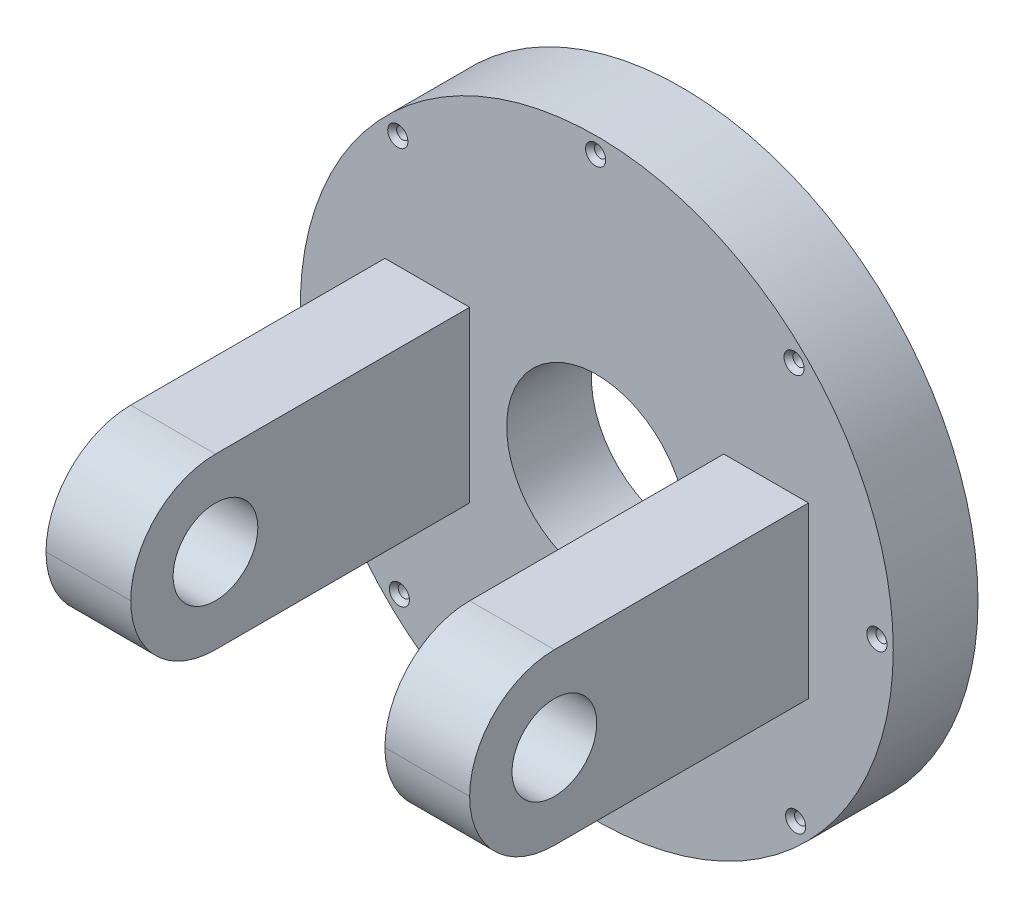
ISO-10303-21;
HEADER;
FILE_DESCRIPTION(('STEP AP214'),'2;1');
FILE_NAME('part.step','',(''),(''),'','','');
FILE_SCHEMA(('AUTOMOTIVE_DESIGN { 1 0 10303 214 1 1 1 1 }'));
ENDSEC;
DATA;
#1=APPLICATION_CONTEXT('core data for automotive mechanical design processes');
#2=APPLICATION_PROTOCOL_DEFINITION('international standard','automotive_design',2000,#1);
#3=PRODUCT_CONTEXT('',#1,'mechanical');
#4=PRODUCT('Part','Part','',(#3));
#5=PRODUCT_RELATED_PRODUCT_CATEGORY('part','',(#4));
#6=PRODUCT_DEFINITION_FORMATION('','',#4);
#7=PRODUCT_DEFINITION_CONTEXT('part definition',#1,'design');
#8=PRODUCT_DEFINITION('design','',#6,#7);
#9=PRODUCT_DEFINITION_SHAPE('','',#8);
#10=(LENGTH_UNIT() NAMED_UNIT(*) SI_UNIT(.MILLI.,.METRE.));
#11=(NAMED_UNIT(*) PLANE_ANGLE_UNIT() SI_UNIT($,.RADIAN.));
#12=(NAMED_UNIT(*) SI_UNIT($,.STERADIAN.) SOLID_ANGLE_UNIT());
#13=UNCERTAINTY_MEASURE_WITH_UNIT(LENGTH_MEASURE(1.E-05),#10,'distance_accuracy_value','');
#14=(GEOMETRIC_REPRESENTATION_CONTEXT(3) GLOBAL_UNCERTAINTY_ASSIGNED_CONTEXT((#13)) GLOBAL_UNIT_ASSIGNED_CONTEXT((#10,
#11,#12)) REPRESENTATION_CONTEXT('',''));
#15=CARTESIAN_POINT('',(0.,0.,0.));
#16=DIRECTION('',(0.,0.,1.));
#17=DIRECTION('',(1.,0.,0.));
#18=AXIS2_PLACEMENT_3D('',#15,#16,#17);
#19=CARTESIAN_POINT('',(0.,0.,6.35));
#20=DIRECTION('',(0.,0.,1.));
#21=DIRECTION('',(1.,0.,0.));
#22=AXIS2_PLACEMENT_3D('',#19,#20,#21);
#23=PLANE('',#22);
#24=CARTESIAN_POINT('',(-29.8163129048879,29.580187368538,6.35));
#25=DIRECTION('',(0.,0.,1.));
#26=DIRECTION('',(1.,0.,0.));
#27=AXIS2_PLACEMENT_3D('',#24,#25,#26);
#28=CIRCLE('',#27,1.5113);
#29=CARTESIAN_POINT('',(-28.3050129048879,29.580187368538,6.35));
#30=VERTEX_POINT('',#29);
#31=EDGE_CURVE('E133',#30,#30,#28,.T.);
#32=ORIENTED_EDGE('',*,*,#31,.F.);
#33=EDGE_LOOP('',(#32));
#34=FACE_BOUND('',#33,.T.);
#35=CARTESIAN_POINT('',(-41.9996681220881,-0.166965967964406,6.35));
#36=DIRECTION('',(0.,0.,1.));
#37=DIRECTION('',(1.,0.,0.));
#38=AXIS2_PLACEMENT_3D('',#35,#36,#37);
#39=CIRCLE('',#38,1.5113);
#40=CARTESIAN_POINT('',(-40.4883681220881,-0.166965967964406,6.35));
#41=VERTEX_POINT('',#40);
#42=EDGE_CURVE('E204',#41,#41,#39,.T.);
#43=ORIENTED_EDGE('',*,*,#42,.F.);
#44=EDGE_LOOP('',(#43));
#45=FACE_BOUND('',#44,.T.);
#46=CARTESIAN_POINT('',(-29.5801873685379,-29.816312904888,6.35));
#47=DIRECTION('',(0.,0.,1.));
#48=DIRECTION('',(1.,0.,0.));
#49=AXIS2_PLACEMENT_3D('',#46,#47,#48);
#50=CIRCLE('',#49,1.5113);
#51=CARTESIAN_POINT('',(-28.0688873685379,-29.816312904888,6.35));
#52=VERTEX_POINT('',#51);
#53=EDGE_CURVE('E216',#52,#52,#50,.T.);
#54=ORIENTED_EDGE('',*,*,#53,.F.);
#55=EDGE_LOOP('',(#54));
#56=FACE_BOUND('',#55,.T.);
#57=CARTESIAN_POINT('',(0.166965967964846,-41.9996681220881,6.35));
#58=DIRECTION('',(0.,0.,1.));
#59=DIRECTION('',(1.,0.,0.));
#60=AXIS2_PLACEMENT_3D('',#57,#58,#59);
#61=CIRCLE('',#60,1.5113);
#62=CARTESIAN_POINT('',(1.67826596796485,-41.9996681220881,6.35));
#63=VERTEX_POINT('',#62);
#64=EDGE_CURVE('E228',#63,#63,#61,.T.);
#65=ORIENTED_EDGE('',*,*,#64,.F.);
#66=EDGE_LOOP('',(#65));
#67=FACE_BOUND('',#66,.T.);
#68=CARTESIAN_POINT('',(29.8163129048881,-29.5801873685378,6.35));
#69=DIRECTION('',(0.,0.,1.));
#70=DIRECTION('',(1.,0.,0.));
#71=AXIS2_PLACEMENT_3D('',#68,#69,#70);
#72=CIRCLE('',#71,1.5113);
#73=CARTESIAN_POINT('',(31.3276129048881,-29.5801873685378,6.35));
#74=VERTEX_POINT('',#73);
#75=EDGE_CURVE('E240',#74,#74,#72,.T.);
#76=ORIENTED_EDGE('',*,*,#75,.F.);
#77=EDGE_LOOP('',(#76));
#78=FACE_BOUND('',#77,.T.);
#79=CARTESIAN_POINT('',(41.9996681220881,0.166965967964699,6.35));
#80=DIRECTION('',(0.,0.,1.));
#81=DIRECTION('',(1.,0.,0.));
#82=AXIS2_PLACEMENT_3D('',#79,#80,#81);
#83=CIRCLE('',#82,1.5113);
#84=CARTESIAN_POINT('',(43.5109681220881,0.166965967964699,6.35));
#85=VERTEX_POINT('',#84);
#86=EDGE_CURVE('E252',#85,#85,#83,.T.);
#87=ORIENTED_EDGE('',*,*,#86,.F.);
#88=EDGE_LOOP('',(#87));
#89=FACE_BOUND('',#88,.T.);
#90=CARTESIAN_POINT('',(29.5801873685377,29.8163129048882,6.35));
#91=DIRECTION('',(0.,0.,1.));
#92=DIRECTION('',(1.,0.,0.));
#93=AXIS2_PLACEMENT_3D('',#90,#91,#92);
#94=CIRCLE('',#93,1.5113);
#95=CARTESIAN_POINT('',(31.0914873685377,29.8163129048882,6.35));
#96=VERTEX_POINT('',#95);
#97=EDGE_CURVE('E264',#96,#96,#94,.T.);
#98=ORIENTED_EDGE('',*,*,#97,.F.);
#99=EDGE_LOOP('',(#98));
#100=FACE_BOUND('',#99,.T.);
#101=CARTESIAN_POINT('',(-0.166965967964846,41.9996681220881,6.35));
#102=DIRECTION('',(0.,0.,1.));
#103=DIRECTION('',(1.,0.,0.));
#104=AXIS2_PLACEMENT_3D('',#101,#102,#103);
#105=CIRCLE('',#104,1.5113);
#106=CARTESIAN_POINT('',(1.34433403203515,41.9996681220881,6.35));
#107=VERTEX_POINT('',#106);
#108=EDGE_CURVE('E276',#107,#107,#105,.T.);
#109=ORIENTED_EDGE('',*,*,#108,.F.);
#110=EDGE_LOOP('',(#109));
#111=FACE_BOUND('',#110,.T.);
#112=CARTESIAN_POINT('',(0.,0.,6.35));
#113=DIRECTION('',(0.,0.,1.));
#114=DIRECTION('',(1.,0.,0.));
#115=AXIS2_PLACEMENT_3D('',#112,#113,#114);
#116=CIRCLE('',#115,13.5);
#117=CARTESIAN_POINT('',(13.5,0.,6.35));
#118=VERTEX_POINT('',#117);
#119=EDGE_CURVE('E288',#118,#118,#116,.T.);
#120=ORIENTED_EDGE('',*,*,#119,.F.);
#121=EDGE_LOOP('',(#120));
#122=FACE_BOUND('',#121,.T.);
#123=CARTESIAN_POINT('',(0.,0.,6.35));
#124=DIRECTION('',(0.,0.,1.));
#125=DIRECTION('',(1.,0.,0.));
#126=AXIS2_PLACEMENT_3D('',#123,#124,#125);
#127=CIRCLE('',#126,44.45);
#128=CARTESIAN_POINT('',(44.45,0.,6.35));
#129=VERTEX_POINT('',#128);
#130=EDGE_CURVE('E297',#129,#129,#127,.T.);
#131=ORIENTED_EDGE('',*,*,#130,.T.);
#132=EDGE_LOOP('',(#131));
#133=FACE_BOUND('',#132,.T.);
#134=DIRECTION('',(-1.,0.,0.));
#135=VECTOR('',#134,1.);
#136=CARTESIAN_POINT('',(31.75,12.7,6.35));
#137=LINE('',#136,#135);
#138=CARTESIAN_POINT('',(31.75,12.7,6.35));
#139=VERTEX_POINT('',#138);
#140=CARTESIAN_POINT('',(19.05,12.7,6.35));
#141=VERTEX_POINT('',#140);
#142=EDGE_CURVE('E186',#139,#141,#137,.T.);
#143=ORIENTED_EDGE('',*,*,#142,.F.);
#144=DIRECTION('',(0.,1.,0.));
#145=VECTOR('',#144,1.);
#146=CARTESIAN_POINT('',(31.75,12.7,6.35));
#147=LINE('',#146,#145);
#148=CARTESIAN_POINT('',(31.75,-12.7,6.35));
#149=VERTEX_POINT('',#148);
#150=EDGE_CURVE('E145',#149,#139,#147,.T.);
#151=ORIENTED_EDGE('',*,*,#150,.F.);
#152=DIRECTION('',(1.,0.,0.));
#153=VECTOR('',#152,1.);
#154=CARTESIAN_POINT('',(31.75,-12.7,6.35));
#155=LINE('',#154,#153);
#156=CARTESIAN_POINT('',(19.05,-12.7,6.35));
#157=VERTEX_POINT('',#156);
#158=EDGE_CURVE('E178',#157,#149,#155,.T.);
#159=ORIENTED_EDGE('',*,*,#158,.F.);
#160=DIRECTION('',(0.,-1.,0.));
#161=VECTOR('',#160,1.);
#162=CARTESIAN_POINT('',(19.05,12.7,6.35));
#163=LINE('',#162,#161);
#164=EDGE_CURVE('E182',#141,#157,#163,.T.);
#165=ORIENTED_EDGE('',*,*,#164,.F.);
#166=EDGE_LOOP('',(#143,#151,#159,#165));
#167=FACE_BOUND('',#166,.T.);
#168=DIRECTION('',(1.,0.,0.));
#169=VECTOR('',#168,1.);
#170=CARTESIAN_POINT('',(-31.75,-12.7,6.35));
#171=LINE('',#170,#169);
#172=CARTESIAN_POINT('',(-31.75,-12.7,6.35));
#173=VERTEX_POINT('',#172);
#174=CARTESIAN_POINT('',(-19.05,-12.7,6.35));
#175=VERTEX_POINT('',#174);
#176=EDGE_CURVE('E126',#173,#175,#171,.T.);
#177=ORIENTED_EDGE('',*,*,#176,.F.);
#178=DIRECTION('',(0.,-1.,0.));
#179=VECTOR('',#178,1.);
#180=CARTESIAN_POINT('',(-31.75,12.7,6.35));
#181=LINE('',#180,#179);
#182=CARTESIAN_POINT('',(-31.75,12.7,6.35));
#183=VERTEX_POINT('',#182);
#184=EDGE_CURVE('E137',#183,#173,#181,.T.);
#185=ORIENTED_EDGE('',*,*,#184,.F.);
#186=DIRECTION('',(-1.,0.,0.));
#187=VECTOR('',#186,1.);
#188=CARTESIAN_POINT('',(-31.75,12.7,6.35));
#189=LINE('',#188,#187);
#190=CARTESIAN_POINT('',(-19.05,12.7,6.35));
#191=VERTEX_POINT('',#190);
#192=EDGE_CURVE('E152',#191,#183,#189,.T.);
#193=ORIENTED_EDGE('',*,*,#192,.F.);
#194=DIRECTION('',(0.,1.,0.));
#195=VECTOR('',#194,1.);
#196=CARTESIAN_POINT('',(-19.05,12.7,6.35));
#197=LINE('',#196,#195);
#198=EDGE_CURVE('E148',#175,#191,#197,.T.);
#199=ORIENTED_EDGE('',*,*,#198,.F.);
#200=EDGE_LOOP('',(#177,#185,#193,#199));
#201=FACE_BOUND('',#200,.T.);
#202=ADVANCED_FACE('F45',(#34,#45,#56,#67,#78,#89,#100,#111,#122,#133,#167,#201),#23,.T.);
#203=CARTESIAN_POINT('',(0.,0.,6.35));
#204=DIRECTION('',(0.,0.,-1.));
#205=DIRECTION('',(-1.,0.,0.));
#206=AXIS2_PLACEMENT_3D('',#203,#204,#205);
#207=CYLINDRICAL_SURFACE('',#206,44.45);
#208=ORIENTED_EDGE('',*,*,#130,.F.);
#209=EDGE_LOOP('',(#208));
#210=FACE_BOUND('',#209,.T.);
#211=CARTESIAN_POINT('',(0.,0.,-6.35));
#212=DIRECTION('',(0.,0.,1.));
#213=DIRECTION('',(1.,0.,0.));
#214=AXIS2_PLACEMENT_3D('',#211,#212,#213);
#215=CIRCLE('',#214,44.45);
#216=CARTESIAN_POINT('',(44.45,0.,-6.35));
#217=VERTEX_POINT('',#216);
#218=EDGE_CURVE('E293',#217,#217,#215,.T.);
#219=ORIENTED_EDGE('',*,*,#218,.T.);
#220=EDGE_LOOP('',(#219));
#221=FACE_BOUND('',#220,.T.);
#222=ADVANCED_FACE('F389',(#210,#221),#207,.T.);
#223=CARTESIAN_POINT('',(0.,0.,-6.35));
#224=DIRECTION('',(0.,0.,1.));
#225=DIRECTION('',(1.,0.,0.));
#226=AXIS2_PLACEMENT_3D('',#223,#224,#225);
#227=PLANE('',#226);
#228=CARTESIAN_POINT('',(-29.8163129048879,29.580187368538,-6.35));
#229=DIRECTION('',(0.,0.,1.));
#230=DIRECTION('',(1.,0.,0.));
#231=AXIS2_PLACEMENT_3D('',#228,#229,#230);
#232=CIRCLE('',#231,0.888999999999997);
#233=CARTESIAN_POINT('',(-28.9273129048879,29.580187368538,-6.35));
#234=VERTEX_POINT('',#233);
#235=EDGE_CURVE('E200',#234,#234,#232,.T.);
#236=ORIENTED_EDGE('',*,*,#235,.T.);
#237=EDGE_LOOP('',(#236));
#238=FACE_BOUND('',#237,.T.);
#239=CARTESIAN_POINT('',(-41.9996681220881,-0.166965967964406,-6.35));
#240=DIRECTION('',(0.,0.,1.));
#241=DIRECTION('',(1.,0.,0.));
#242=AXIS2_PLACEMENT_3D('',#239,#240,#241);
#243=CIRCLE('',#242,0.889000000000001);
#244=CARTESIAN_POINT('',(-41.1106681220881,-0.166965967964406,-6.35));
#245=VERTEX_POINT('',#244);
#246=EDGE_CURVE('E212',#245,#245,#243,.T.);
#247=ORIENTED_EDGE('',*,*,#246,.T.);
#248=EDGE_LOOP('',(#247));
#249=FACE_BOUND('',#248,.T.);
#250=CARTESIAN_POINT('',(-29.5801873685379,-29.816312904888,-6.35));
#251=DIRECTION('',(0.,0.,1.));
#252=DIRECTION('',(1.,0.,0.));
#253=AXIS2_PLACEMENT_3D('',#250,#251,#252);
#254=CIRCLE('',#253,0.888999999999997);
#255=CARTESIAN_POINT('',(-28.6911873685379,-29.816312904888,-6.35));
#256=VERTEX_POINT('',#255);
#257=EDGE_CURVE('E224',#256,#256,#254,.T.);
#258=ORIENTED_EDGE('',*,*,#257,.T.);
#259=EDGE_LOOP('',(#258));
#260=FACE_BOUND('',#259,.T.);
#261=CARTESIAN_POINT('',(0.166965967964846,-41.9996681220881,-6.35));
#262=DIRECTION('',(0.,0.,1.));
#263=DIRECTION('',(1.,0.,0.));
#264=AXIS2_PLACEMENT_3D('',#261,#262,#263);
#265=CIRCLE('',#264,0.888999999999998);
#266=CARTESIAN_POINT('',(1.05596596796484,-41.9996681220881,-6.35));
#267=VERTEX_POINT('',#266);
#268=EDGE_CURVE('E236',#267,#267,#265,.T.);
#269=ORIENTED_EDGE('',*,*,#268,.T.);
#270=EDGE_LOOP('',(#269));
#271=FACE_BOUND('',#270,.T.);
#272=CARTESIAN_POINT('',(29.8163129048881,-29.5801873685378,-6.35));
#273=DIRECTION('',(0.,0.,1.));
#274=DIRECTION('',(1.,0.,0.));
#275=AXIS2_PLACEMENT_3D('',#272,#273,#274);
#276=CIRCLE('',#275,0.888999999999997);
#277=CARTESIAN_POINT('',(30.7053129048881,-29.5801873685378,-6.35));
#278=VERTEX_POINT('',#277);
#279=EDGE_CURVE('E248',#278,#278,#276,.T.);
#280=ORIENTED_EDGE('',*,*,#279,.T.);
#281=EDGE_LOOP('',(#280));
#282=FACE_BOUND('',#281,.T.);
#283=CARTESIAN_POINT('',(41.9996681220881,0.166965967964699,-6.35));
#284=DIRECTION('',(0.,0.,1.));
#285=DIRECTION('',(1.,0.,0.));
#286=AXIS2_PLACEMENT_3D('',#283,#284,#285);
#287=CIRCLE('',#286,0.889000000000001);
#288=CARTESIAN_POINT('',(42.8886681220881,0.166965967964699,-6.35));
#289=VERTEX_POINT('',#288);
#290=EDGE_CURVE('E260',#289,#289,#287,.T.);
#291=ORIENTED_EDGE('',*,*,#290,.T.);
#292=EDGE_LOOP('',(#291));
#293=FACE_BOUND('',#292,.T.);
#294=CARTESIAN_POINT('',(29.5801873685377,29.8163129048882,-6.35));
#295=DIRECTION('',(0.,0.,1.));
#296=DIRECTION('',(1.,0.,0.));
#297=AXIS2_PLACEMENT_3D('',#294,#295,#296);
#298=CIRCLE('',#297,0.888999999999997);
#299=CARTESIAN_POINT('',(30.4691873685377,29.8163129048882,-6.35));
#300=VERTEX_POINT('',#299);
#301=EDGE_CURVE('E272',#300,#300,#298,.T.);
#302=ORIENTED_EDGE('',*,*,#301,.T.);
#303=EDGE_LOOP('',(#302));
#304=FACE_BOUND('',#303,.T.);
#305=CARTESIAN_POINT('',(-0.166965967964846,41.9996681220881,-6.35));
#306=DIRECTION('',(0.,0.,1.));
#307=DIRECTION('',(1.,0.,0.));
#308=AXIS2_PLACEMENT_3D('',#305,#306,#307);
#309=CIRCLE('',#308,0.888999999999998);
#310=CARTESIAN_POINT('',(0.722034032035152,41.9996681220881,-6.35));
#311=VERTEX_POINT('',#310);
#312=EDGE_CURVE('E284',#311,#311,#309,.T.);
#313=ORIENTED_EDGE('',*,*,#312,.T.);
#314=EDGE_LOOP('',(#313));
#315=FACE_BOUND('',#314,.T.);
#316=CARTESIAN_POINT('',(0.,0.,-6.35));
#317=DIRECTION('',(0.,0.,1.));
#318=DIRECTION('',(1.,0.,0.));
#319=AXIS2_PLACEMENT_3D('',#316,#317,#318);
#320=CIRCLE('',#319,13.5);
#321=CARTESIAN_POINT('',(13.5,0.,-6.35));
#322=VERTEX_POINT('',#321);
#323=EDGE_CURVE('E289',#322,#322,#320,.T.);
#324=ORIENTED_EDGE('',*,*,#323,.T.);
#325=EDGE_LOOP('',(#324));
#326=FACE_BOUND('',#325,.T.);
#327=ORIENTED_EDGE('',*,*,#218,.F.);
#328=EDGE_LOOP('',(#327));
#329=FACE_BOUND('',#328,.T.);
#330=ADVANCED_FACE('F397',(#238,#249,#260,#271,#282,#293,#304,#315,#326,#329),#227,.F.);
#331=CARTESIAN_POINT('',(0.,0.,-6.35));
#332=DIRECTION('',(0.,0.,1.));
#333=DIRECTION('',(1.,0.,0.));
#334=AXIS2_PLACEMENT_3D('',#331,#332,#333);
#335=CYLINDRICAL_SURFACE('',#334,13.5);
#336=ORIENTED_EDGE('',*,*,#323,.F.);
#337=EDGE_LOOP('',(#336));
#338=FACE_BOUND('',#337,.T.);
#339=ORIENTED_EDGE('',*,*,#119,.T.);
#340=EDGE_LOOP('',(#339));
#341=FACE_BOUND('',#340,.T.);
#342=ADVANCED_FACE('F404',(#338,#341),#335,.F.);
#343=CARTESIAN_POINT('',(-0.166965967964846,41.9996681220881,6.35));
#344=DIRECTION('',(0.,0.,1.));
#345=DIRECTION('',(1.,0.,0.));
#346=AXIS2_PLACEMENT_3D('',#343,#344,#345);
#347=CYLINDRICAL_SURFACE('',#346,0.888999999999999);
#348=ORIENTED_EDGE('',*,*,#312,.F.);
#349=EDGE_LOOP('',(#348));
#350=FACE_BOUND('',#349,.T.);
#351=CARTESIAN_POINT('',(-0.166965967964846,41.9996681220881,5.63412574018637));
#352=DIRECTION('',(0.,0.,1.));
#353=DIRECTION('',(1.,0.,0.));
#354=AXIS2_PLACEMENT_3D('',#351,#352,#353);
#355=CIRCLE('',#354,0.889);
#356=CARTESIAN_POINT('',(0.722034032035154,41.9996681220881,5.63412574018637));
#357=VERTEX_POINT('',#356);
#358=EDGE_CURVE('E280',#357,#357,#355,.T.);
#359=ORIENTED_EDGE('',*,*,#358,.T.);
#360=EDGE_LOOP('',(#359));
#361=FACE_BOUND('',#360,.T.);
#362=ADVANCED_FACE('F500',(#350,#361),#347,.F.);
#363=CARTESIAN_POINT('',(-0.166965967964846,41.9996681220881,6.35));
#364=DIRECTION('',(0.,0.,1.));
#365=DIRECTION('',(1.,0.,0.));
#366=AXIS2_PLACEMENT_3D('',#363,#364,#365);
#367=CONICAL_SURFACE('',#366,1.5113,0.715584993317674);
#368=ORIENTED_EDGE('',*,*,#358,.F.);
#369=EDGE_LOOP('',(#368));
#370=FACE_BOUND('',#369,.T.);
#371=ORIENTED_EDGE('',*,*,#108,.T.);
#372=EDGE_LOOP('',(#371));
#373=FACE_BOUND('',#372,.T.);
#374=ADVANCED_FACE('F497',(#370,#373),#367,.F.);
#375=CARTESIAN_POINT('',(29.5801873685377,29.8163129048882,6.35));
#376=DIRECTION('',(0.,0.,1.));
#377=DIRECTION('',(1.,0.,0.));
#378=AXIS2_PLACEMENT_3D('',#375,#376,#377);
#379=CYLINDRICAL_SURFACE('',#378,0.888999999999999);
#380=ORIENTED_EDGE('',*,*,#301,.F.);
#381=EDGE_LOOP('',(#380));
#382=FACE_BOUND('',#381,.T.);
#383=CARTESIAN_POINT('',(29.5801873685377,29.8163129048882,5.63412574018637));
#384=DIRECTION('',(0.,0.,1.));
#385=DIRECTION('',(1.,0.,0.));
#386=AXIS2_PLACEMENT_3D('',#383,#384,#385);
#387=CIRCLE('',#386,0.889000000000001);
#388=CARTESIAN_POINT('',(30.4691873685377,29.8163129048882,5.63412574018637));
#389=VERTEX_POINT('',#388);
#390=EDGE_CURVE('E268',#389,#389,#387,.T.);
#391=ORIENTED_EDGE('',*,*,#390,.T.);
#392=EDGE_LOOP('',(#391));
#393=FACE_BOUND('',#392,.T.);
#394=ADVANCED_FACE('F493',(#382,#393),#379,.F.);
#395=CARTESIAN_POINT('',(29.5801873685377,29.8163129048882,6.35));
#396=DIRECTION('',(0.,0.,1.));
#397=DIRECTION('',(1.,0.,0.));
#398=AXIS2_PLACEMENT_3D('',#395,#396,#397);
#399=CONICAL_SURFACE('',#398,1.5113,0.715584993317673);
#400=ORIENTED_EDGE('',*,*,#390,.F.);
#401=EDGE_LOOP('',(#400));
#402=FACE_BOUND('',#401,.T.);
#403=ORIENTED_EDGE('',*,*,#97,.T.);
#404=EDGE_LOOP('',(#403));
#405=FACE_BOUND('',#404,.T.);
#406=ADVANCED_FACE('F489',(#402,#405),#399,.F.);
#407=CARTESIAN_POINT('',(41.9996681220881,0.166965967964699,6.35));
#408=DIRECTION('',(0.,0.,1.));
#409=DIRECTION('',(1.,0.,0.));
#410=AXIS2_PLACEMENT_3D('',#407,#408,#409);
#411=CYLINDRICAL_SURFACE('',#410,0.889000000000001);
#412=ORIENTED_EDGE('',*,*,#290,.F.);
#413=EDGE_LOOP('',(#412));
#414=FACE_BOUND('',#413,.T.);
#415=CARTESIAN_POINT('',(41.9996681220881,0.166965967964699,5.63412574018637));
#416=DIRECTION('',(0.,0.,1.));
#417=DIRECTION('',(1.,0.,0.));
#418=AXIS2_PLACEMENT_3D('',#415,#416,#417);
#419=CIRCLE('',#418,0.889000000000001);
#420=CARTESIAN_POINT('',(42.8886681220881,0.166965967964699,5.63412574018637));
#421=VERTEX_POINT('',#420);
#422=EDGE_CURVE('E256',#421,#421,#419,.T.);
#423=ORIENTED_EDGE('',*,*,#422,.T.);
#424=EDGE_LOOP('',(#423));
#425=FACE_BOUND('',#424,.T.);
#426=ADVANCED_FACE('F485',(#414,#425),#411,.F.);
#427=CARTESIAN_POINT('',(41.9996681220881,0.166965967964699,6.35));
#428=DIRECTION('',(0.,0.,1.));
#429=DIRECTION('',(1.,0.,0.));
#430=AXIS2_PLACEMENT_3D('',#427,#428,#429);
#431=CONICAL_SURFACE('',#430,1.5113,0.715584993317673);
#432=ORIENTED_EDGE('',*,*,#422,.F.);
#433=EDGE_LOOP('',(#432));
#434=FACE_BOUND('',#433,.T.);
#435=ORIENTED_EDGE('',*,*,#86,.T.);
#436=EDGE_LOOP('',(#435));
#437=FACE_BOUND('',#436,.T.);
#438=ADVANCED_FACE('F481',(#434,#437),#431,.F.);
#439=CARTESIAN_POINT('',(29.8163129048881,-29.5801873685378,6.35));
#440=DIRECTION('',(0.,0.,1.));
#441=DIRECTION('',(1.,0.,0.));
#442=AXIS2_PLACEMENT_3D('',#439,#440,#441);
#443=CYLINDRICAL_SURFACE('',#442,0.888999999999999);
#444=ORIENTED_EDGE('',*,*,#279,.F.);
#445=EDGE_LOOP('',(#444));
#446=FACE_BOUND('',#445,.T.);
#447=CARTESIAN_POINT('',(29.8163129048881,-29.5801873685378,5.63412574018637));
#448=DIRECTION('',(0.,0.,1.));
#449=DIRECTION('',(1.,0.,0.));
#450=AXIS2_PLACEMENT_3D('',#447,#448,#449);
#451=CIRCLE('',#450,0.889000000000001);
#452=CARTESIAN_POINT('',(30.7053129048881,-29.5801873685378,5.63412574018637));
#453=VERTEX_POINT('',#452);
#454=EDGE_CURVE('E244',#453,#453,#451,.T.);
#455=ORIENTED_EDGE('',*,*,#454,.T.);
#456=EDGE_LOOP('',(#455));
#457=FACE_BOUND('',#456,.T.);
#458=ADVANCED_FACE('F477',(#446,#457),#443,.F.);
#459=CARTESIAN_POINT('',(29.8163129048881,-29.5801873685378,6.35));
#460=DIRECTION('',(0.,0.,1.));
#461=DIRECTION('',(1.,0.,0.));
#462=AXIS2_PLACEMENT_3D('',#459,#460,#461);
#463=CONICAL_SURFACE('',#462,1.5113,0.715584993317671);
#464=ORIENTED_EDGE('',*,*,#454,.F.);
#465=EDGE_LOOP('',(#464));
#466=FACE_BOUND('',#465,.T.);
#467=ORIENTED_EDGE('',*,*,#75,.T.);
#468=EDGE_LOOP('',(#467));
#469=FACE_BOUND('',#468,.T.);
#470=ADVANCED_FACE('F473',(#466,#469),#463,.F.);
#471=CARTESIAN_POINT('',(0.166965967964846,-41.9996681220881,6.35));
#472=DIRECTION('',(0.,0.,1.));
#473=DIRECTION('',(1.,0.,0.));
#474=AXIS2_PLACEMENT_3D('',#471,#472,#473);
#475=CYLINDRICAL_SURFACE('',#474,0.888999999999999);
#476=ORIENTED_EDGE('',*,*,#268,.F.);
#477=EDGE_LOOP('',(#476));
#478=FACE_BOUND('',#477,.T.);
#479=CARTESIAN_POINT('',(0.166965967964846,-41.9996681220881,5.63412574018637));
#480=DIRECTION('',(0.,0.,1.));
#481=DIRECTION('',(1.,0.,0.));
#482=AXIS2_PLACEMENT_3D('',#479,#480,#481);
#483=CIRCLE('',#482,0.889);
#484=CARTESIAN_POINT('',(1.05596596796485,-41.9996681220881,5.63412574018637));
#485=VERTEX_POINT('',#484);
#486=EDGE_CURVE('E232',#485,#485,#483,.T.);
#487=ORIENTED_EDGE('',*,*,#486,.T.);
#488=EDGE_LOOP('',(#487));
#489=FACE_BOUND('',#488,.T.);
#490=ADVANCED_FACE('F469',(#478,#489),#475,.F.);
#491=CARTESIAN_POINT('',(0.166965967964846,-41.9996681220881,6.35));
#492=DIRECTION('',(0.,0.,1.));
#493=DIRECTION('',(1.,0.,0.));
#494=AXIS2_PLACEMENT_3D('',#491,#492,#493);
#495=CONICAL_SURFACE('',#494,1.5113,0.715584993317674);
#496=ORIENTED_EDGE('',*,*,#486,.F.);
#497=EDGE_LOOP('',(#496));
#498=FACE_BOUND('',#497,.T.);
#499=ORIENTED_EDGE('',*,*,#64,.T.);
#500=EDGE_LOOP('',(#499));
#501=FACE_BOUND('',#500,.T.);
#502=ADVANCED_FACE('F465',(#498,#501),#495,.F.);
#503=CARTESIAN_POINT('',(-29.5801873685379,-29.816312904888,6.35));
#504=DIRECTION('',(0.,0.,1.));
#505=DIRECTION('',(1.,0.,0.));
#506=AXIS2_PLACEMENT_3D('',#503,#504,#505);
#507=CYLINDRICAL_SURFACE('',#506,0.888999999999999);
#508=ORIENTED_EDGE('',*,*,#257,.F.);
#509=EDGE_LOOP('',(#508));
#510=FACE_BOUND('',#509,.T.);
#511=CARTESIAN_POINT('',(-29.5801873685379,-29.816312904888,5.63412574018637));
#512=DIRECTION('',(0.,0.,1.));
#513=DIRECTION('',(1.,0.,0.));
#514=AXIS2_PLACEMENT_3D('',#511,#512,#513);
#515=CIRCLE('',#514,0.889000000000001);
#516=CARTESIAN_POINT('',(-28.6911873685379,-29.816312904888,5.63412574018637));
#517=VERTEX_POINT('',#516);
#518=EDGE_CURVE('E220',#517,#517,#515,.T.);
#519=ORIENTED_EDGE('',*,*,#518,.T.);
#520=EDGE_LOOP('',(#519));
#521=FACE_BOUND('',#520,.T.);
#522=ADVANCED_FACE('F461',(#510,#521),#507,.F.);
#523=CARTESIAN_POINT('',(-29.5801873685379,-29.816312904888,6.35));
#524=DIRECTION('',(0.,0.,1.));
#525=DIRECTION('',(1.,0.,0.));
#526=AXIS2_PLACEMENT_3D('',#523,#524,#525);
#527=CONICAL_SURFACE('',#526,1.5113,0.715584993317673);
#528=ORIENTED_EDGE('',*,*,#518,.F.);
#529=EDGE_LOOP('',(#528));
#530=FACE_BOUND('',#529,.T.);
#531=ORIENTED_EDGE('',*,*,#53,.T.);
#532=EDGE_LOOP('',(#531));
#533=FACE_BOUND('',#532,.T.);
#534=ADVANCED_FACE('F457',(#530,#533),#527,.F.);
#535=CARTESIAN_POINT('',(-41.9996681220881,-0.166965967964406,6.35));
#536=DIRECTION('',(0.,0.,1.));
#537=DIRECTION('',(1.,0.,0.));
#538=AXIS2_PLACEMENT_3D('',#535,#536,#537);
#539=CYLINDRICAL_SURFACE('',#538,0.889000000000001);
#540=ORIENTED_EDGE('',*,*,#246,.F.);
#541=EDGE_LOOP('',(#540));
#542=FACE_BOUND('',#541,.T.);
#543=CARTESIAN_POINT('',(-41.9996681220881,-0.166965967964406,5.63412574018637));
#544=DIRECTION('',(0.,0.,1.));
#545=DIRECTION('',(1.,0.,0.));
#546=AXIS2_PLACEMENT_3D('',#543,#544,#545);
#547=CIRCLE('',#546,0.889000000000001);
#548=CARTESIAN_POINT('',(-41.1106681220881,-0.166965967964406,5.63412574018637));
#549=VERTEX_POINT('',#548);
#550=EDGE_CURVE('E208',#549,#549,#547,.T.);
#551=ORIENTED_EDGE('',*,*,#550,.T.);
#552=EDGE_LOOP('',(#551));
#553=FACE_BOUND('',#552,.T.);
#554=ADVANCED_FACE('F453',(#542,#553),#539,.F.);
#555=CARTESIAN_POINT('',(-41.9996681220881,-0.166965967964406,6.35));
#556=DIRECTION('',(0.,0.,1.));
#557=DIRECTION('',(1.,0.,0.));
#558=AXIS2_PLACEMENT_3D('',#555,#556,#557);
#559=CONICAL_SURFACE('',#558,1.5113,0.715584993317673);
#560=ORIENTED_EDGE('',*,*,#550,.F.);
#561=EDGE_LOOP('',(#560));
#562=FACE_BOUND('',#561,.T.);
#563=ORIENTED_EDGE('',*,*,#42,.T.);
#564=EDGE_LOOP('',(#563));
#565=FACE_BOUND('',#564,.T.);
#566=ADVANCED_FACE('F449',(#562,#565),#559,.F.);
#567=CARTESIAN_POINT('',(-29.8163129048879,29.580187368538,6.35));
#568=DIRECTION('',(0.,0.,1.));
#569=DIRECTION('',(1.,0.,0.));
#570=AXIS2_PLACEMENT_3D('',#567,#568,#569);
#571=CYLINDRICAL_SURFACE('',#570,0.888999999999999);
#572=ORIENTED_EDGE('',*,*,#235,.F.);
#573=EDGE_LOOP('',(#572));
#574=FACE_BOUND('',#573,.T.);
#575=CARTESIAN_POINT('',(-29.8163129048879,29.580187368538,5.63412574018637));
#576=DIRECTION('',(0.,0.,1.));
#577=DIRECTION('',(1.,0.,0.));
#578=AXIS2_PLACEMENT_3D('',#575,#576,#577);
#579=CIRCLE('',#578,0.889000000000001);
#580=CARTESIAN_POINT('',(-28.9273129048879,29.580187368538,5.63412574018637));
#581=VERTEX_POINT('',#580);
#582=EDGE_CURVE('E196',#581,#581,#579,.T.);
#583=ORIENTED_EDGE('',*,*,#582,.T.);
#584=EDGE_LOOP('',(#583));
#585=FACE_BOUND('',#584,.T.);
#586=ADVANCED_FACE('F445',(#574,#585),#571,.F.);
#587=CARTESIAN_POINT('',(-29.8163129048879,29.580187368538,6.35));
#588=DIRECTION('',(0.,0.,1.));
#589=DIRECTION('',(1.,0.,0.));
#590=AXIS2_PLACEMENT_3D('',#587,#588,#589);
#591=CONICAL_SURFACE('',#590,1.5113,0.715584993317673);
#592=ORIENTED_EDGE('',*,*,#582,.F.);
#593=EDGE_LOOP('',(#592));
#594=FACE_BOUND('',#593,.T.);
#595=ORIENTED_EDGE('',*,*,#31,.T.);
#596=EDGE_LOOP('',(#595));
#597=FACE_BOUND('',#596,.T.);
#598=ADVANCED_FACE('F441',(#594,#597),#591,.F.);
#599=CARTESIAN_POINT('',(31.75,12.7,57.15));
#600=DIRECTION('',(-1.,0.,0.));
#601=DIRECTION('',(0.,0.,1.));
#602=AXIS2_PLACEMENT_3D('',#599,#600,#601);
#603=PLANE('',#602);
#604=CARTESIAN_POINT('',(31.75,0.,44.45));
#605=DIRECTION('',(1.,0.,0.));
#606=DIRECTION('',(0.,0.,-1.));
#607=AXIS2_PLACEMENT_3D('',#604,#605,#606);
#608=CIRCLE('',#607,6.35);
#609=CARTESIAN_POINT('',(31.75,0.,38.1));
#610=VERTEX_POINT('',#609);
#611=EDGE_CURVE('E354',#610,#610,#608,.T.);
#612=ORIENTED_EDGE('',*,*,#611,.F.);
#613=EDGE_LOOP('',(#612));
#614=FACE_BOUND('',#613,.T.);
#615=CARTESIAN_POINT('',(31.75,0.,44.45));
#616=DIRECTION('',(-1.,0.,0.));
#617=DIRECTION('',(0.,0.,1.));
#618=AXIS2_PLACEMENT_3D('',#615,#616,#617);
#619=CIRCLE('',#618,12.7);
#620=CARTESIAN_POINT('',(31.75,12.7,44.45));
#621=VERTEX_POINT('',#620);
#622=CARTESIAN_POINT('',(31.75,0.,57.15));
#623=VERTEX_POINT('',#622);
#624=EDGE_CURVE('E322',#621,#623,#619,.F.);
#625=ORIENTED_EDGE('',*,*,#624,.T.);
#626=CARTESIAN_POINT('',(31.75,0.,44.45));
#627=DIRECTION('',(-1.,0.,0.));
#628=DIRECTION('',(0.,0.,1.));
#629=AXIS2_PLACEMENT_3D('',#626,#627,#628);
#630=CIRCLE('',#629,12.7);
#631=CARTESIAN_POINT('',(31.75,-12.7,44.45));
#632=VERTEX_POINT('',#631);
#633=EDGE_CURVE('E325',#623,#632,#630,.F.);
#634=ORIENTED_EDGE('',*,*,#633,.T.);
#635=DIRECTION('',(0.,0.,-1.));
#636=VECTOR('',#635,1.);
#637=CARTESIAN_POINT('',(31.75,-12.7,57.15));
#638=LINE('',#637,#636);
#639=EDGE_CURVE('E175',#632,#149,#638,.T.);
#640=ORIENTED_EDGE('',*,*,#639,.T.);
#641=ORIENTED_EDGE('',*,*,#150,.T.);
#642=DIRECTION('',(0.,0.,-1.));
#643=VECTOR('',#642,1.);
#644=CARTESIAN_POINT('',(31.75,12.7,57.15));
#645=LINE('',#644,#643);
#646=EDGE_CURVE('E165',#621,#139,#645,.T.);
#647=ORIENTED_EDGE('',*,*,#646,.F.);
#648=EDGE_LOOP('',(#625,#634,#640,#641,#647));
#649=FACE_BOUND('',#648,.T.);
#650=ADVANCED_FACE('F432',(#614,#649),#603,.F.);
#651=CARTESIAN_POINT('',(31.75,12.7,57.15));
#652=DIRECTION('',(0.,-1.,0.));
#653=DIRECTION('',(1.,0.,0.));
#654=AXIS2_PLACEMENT_3D('',#651,#652,#653);
#655=PLANE('',#654);
#656=DIRECTION('',(0.,0.,-1.));
#657=VECTOR('',#656,1.);
#658=CARTESIAN_POINT('',(19.05,12.7,57.15));
#659=LINE('',#658,#657);
#660=CARTESIAN_POINT('',(19.05,12.7,44.45));
#661=VERTEX_POINT('',#660);
#662=EDGE_CURVE('E168',#661,#141,#659,.T.);
#663=ORIENTED_EDGE('',*,*,#662,.F.);
#664=DIRECTION('',(-1.,0.,0.));
#665=VECTOR('',#664,1.);
#666=CARTESIAN_POINT('',(31.75,12.7,44.45));
#667=LINE('',#666,#665);
#668=EDGE_CURVE('E11',#661,#621,#667,.F.);
#669=ORIENTED_EDGE('',*,*,#668,.T.);
#670=ORIENTED_EDGE('',*,*,#646,.T.);
#671=ORIENTED_EDGE('',*,*,#142,.T.);
#672=EDGE_LOOP('',(#663,#669,#670,#671));
#673=FACE_BOUND('',#672,.T.);
#674=ADVANCED_FACE('F436',(#673),#655,.F.);
#675=CARTESIAN_POINT('',(19.05,12.7,57.15));
#676=DIRECTION('',(1.,0.,0.));
#677=DIRECTION('',(0.,0.,-1.));
#678=AXIS2_PLACEMENT_3D('',#675,#676,#677);
#679=PLANE('',#678);
#680=CARTESIAN_POINT('',(19.05,0.,44.45));
#681=DIRECTION('',(1.,0.,0.));
#682=DIRECTION('',(0.,0.,-1.));
#683=AXIS2_PLACEMENT_3D('',#680,#681,#682);
#684=CIRCLE('',#683,6.35);
#685=CARTESIAN_POINT('',(19.05,0.,38.1));
#686=VERTEX_POINT('',#685);
#687=EDGE_CURVE('E341',#686,#686,#684,.T.);
#688=ORIENTED_EDGE('',*,*,#687,.T.);
#689=EDGE_LOOP('',(#688));
#690=FACE_BOUND('',#689,.T.);
#691=DIRECTION('',(0.,0.,-1.));
#692=VECTOR('',#691,1.);
#693=CARTESIAN_POINT('',(19.05,-12.7,57.15));
#694=LINE('',#693,#692);
#695=CARTESIAN_POINT('',(19.05,-12.7,44.45));
#696=VERTEX_POINT('',#695);
#697=EDGE_CURVE('E172',#696,#157,#694,.T.);
#698=ORIENTED_EDGE('',*,*,#697,.F.);
#699=CARTESIAN_POINT('',(19.05,0.,44.45));
#700=DIRECTION('',(1.,0.,0.));
#701=DIRECTION('',(0.,0.,-1.));
#702=AXIS2_PLACEMENT_3D('',#699,#700,#701);
#703=CIRCLE('',#702,12.7);
#704=CARTESIAN_POINT('',(19.05,0.,57.15));
#705=VERTEX_POINT('',#704);
#706=EDGE_CURVE('E55',#696,#705,#703,.F.);
#707=ORIENTED_EDGE('',*,*,#706,.T.);
#708=CARTESIAN_POINT('',(19.05,0.,44.45));
#709=DIRECTION('',(1.,0.,0.));
#710=DIRECTION('',(0.,0.,-1.));
#711=AXIS2_PLACEMENT_3D('',#708,#709,#710);
#712=CIRCLE('',#711,12.7);
#713=EDGE_CURVE('E63',#705,#661,#712,.F.);
#714=ORIENTED_EDGE('',*,*,#713,.T.);
#715=ORIENTED_EDGE('',*,*,#662,.T.);
#716=ORIENTED_EDGE('',*,*,#164,.T.);
#717=EDGE_LOOP('',(#698,#707,#714,#715,#716));
#718=FACE_BOUND('',#717,.T.);
#719=ADVANCED_FACE('F384',(#690,#718),#679,.F.);
#720=CARTESIAN_POINT('',(31.75,-12.7,57.15));
#721=DIRECTION('',(0.,1.,0.));
#722=DIRECTION('',(-1.,0.,0.));
#723=AXIS2_PLACEMENT_3D('',#720,#721,#722);
#724=PLANE('',#723);
#725=ORIENTED_EDGE('',*,*,#639,.F.);
#726=DIRECTION('',(1.,0.,0.));
#727=VECTOR('',#726,1.);
#728=CARTESIAN_POINT('',(31.75,-12.7,44.45));
#729=LINE('',#728,#727);
#730=EDGE_CURVE('E328',#632,#696,#729,.F.);
#731=ORIENTED_EDGE('',*,*,#730,.T.);
#732=ORIENTED_EDGE('',*,*,#697,.T.);
#733=ORIENTED_EDGE('',*,*,#158,.T.);
#734=EDGE_LOOP('',(#725,#731,#732,#733));
#735=FACE_BOUND('',#734,.T.);
#736=ADVANCED_FACE('F375',(#735),#724,.F.);
#737=CARTESIAN_POINT('',(-31.75,12.7,57.15));
#738=DIRECTION('',(1.,0.,0.));
#739=DIRECTION('',(0.,0.,-1.));
#740=AXIS2_PLACEMENT_3D('',#737,#738,#739);
#741=PLANE('',#740);
#742=CARTESIAN_POINT('',(-31.75,0.,44.45));
#743=DIRECTION('',(1.,0.,0.));
#744=DIRECTION('',(0.,0.,-1.));
#745=AXIS2_PLACEMENT_3D('',#742,#743,#744);
#746=CIRCLE('',#745,6.35);
#747=CARTESIAN_POINT('',(-31.75,0.,38.1));
#748=VERTEX_POINT('',#747);
#749=EDGE_CURVE('E347',#748,#748,#746,.T.);
#750=ORIENTED_EDGE('',*,*,#749,.T.);
#751=EDGE_LOOP('',(#750));
#752=FACE_BOUND('',#751,.T.);
#753=CARTESIAN_POINT('',(-31.75,0.,44.45));
#754=DIRECTION('',(1.,0.,0.));
#755=DIRECTION('',(0.,0.,-1.));
#756=AXIS2_PLACEMENT_3D('',#753,#754,#755);
#757=CIRCLE('',#756,12.7);
#758=CARTESIAN_POINT('',(-31.75,-12.7,44.45));
#759=VERTEX_POINT('',#758);
#760=CARTESIAN_POINT('',(-31.75,0.,57.15));
#761=VERTEX_POINT('',#760);
#762=EDGE_CURVE('E301',#759,#761,#757,.F.);
#763=ORIENTED_EDGE('',*,*,#762,.T.);
#764=CARTESIAN_POINT('',(-31.75,0.,44.45));
#765=DIRECTION('',(1.,0.,0.));
#766=DIRECTION('',(0.,0.,-1.));
#767=AXIS2_PLACEMENT_3D('',#764,#765,#766);
#768=CIRCLE('',#767,12.7);
#769=CARTESIAN_POINT('',(-31.75,12.7,44.45));
#770=VERTEX_POINT('',#769);
#771=EDGE_CURVE('E307',#761,#770,#768,.F.);
#772=ORIENTED_EDGE('',*,*,#771,.T.);
#773=DIRECTION('',(0.,0.,-1.));
#774=VECTOR('',#773,1.);
#775=CARTESIAN_POINT('',(-31.75,12.7,57.15));
#776=LINE('',#775,#774);
#777=EDGE_CURVE('E140',#770,#183,#776,.T.);
#778=ORIENTED_EDGE('',*,*,#777,.T.);
#779=ORIENTED_EDGE('',*,*,#184,.T.);
#780=DIRECTION('',(0.,0.,-1.));
#781=VECTOR('',#780,1.);
#782=CARTESIAN_POINT('',(-31.75,-12.7,57.15));
#783=LINE('',#782,#781);
#784=EDGE_CURVE('E121',#759,#173,#783,.T.);
#785=ORIENTED_EDGE('',*,*,#784,.F.);
#786=EDGE_LOOP('',(#763,#772,#778,#779,#785));
#787=FACE_BOUND('',#786,.T.);
#788=ADVANCED_FACE('F138',(#752,#787),#741,.F.);
#789=CARTESIAN_POINT('',(-31.75,-12.7,57.15));
#790=DIRECTION('',(0.,1.,0.));
#791=DIRECTION('',(-1.,0.,0.));
#792=AXIS2_PLACEMENT_3D('',#789,#790,#791);
#793=PLANE('',#792);
#794=DIRECTION('',(0.,0.,-1.));
#795=VECTOR('',#794,1.);
#796=CARTESIAN_POINT('',(-19.05,-12.7,57.15));
#797=LINE('',#796,#795);
#798=CARTESIAN_POINT('',(-19.05,-12.7,44.45));
#799=VERTEX_POINT('',#798);
#800=EDGE_CURVE('E134',#799,#175,#797,.T.);
#801=ORIENTED_EDGE('',*,*,#800,.F.);
#802=DIRECTION('',(1.,0.,0.));
#803=VECTOR('',#802,1.);
#804=CARTESIAN_POINT('',(-31.75,-12.7,44.45));
#805=LINE('',#804,#803);
#806=EDGE_CURVE('E129',#799,#759,#805,.F.);
#807=ORIENTED_EDGE('',*,*,#806,.T.);
#808=ORIENTED_EDGE('',*,*,#784,.T.);
#809=ORIENTED_EDGE('',*,*,#176,.T.);
#810=EDGE_LOOP('',(#801,#807,#808,#809));
#811=FACE_BOUND('',#810,.T.);
#812=ADVANCED_FACE('F124',(#811),#793,.F.);
#813=CARTESIAN_POINT('',(-19.05,12.7,57.15));
#814=DIRECTION('',(-1.,0.,0.));
#815=DIRECTION('',(0.,0.,1.));
#816=AXIS2_PLACEMENT_3D('',#813,#814,#815);
#817=PLANE('',#816);
#818=CARTESIAN_POINT('',(-19.05,0.,44.45));
#819=DIRECTION('',(-1.,0.,0.));
#820=DIRECTION('',(0.,0.,1.));
#821=AXIS2_PLACEMENT_3D('',#818,#819,#820);
#822=CIRCLE('',#821,6.35);
#823=CARTESIAN_POINT('',(-19.05,0.,50.8));
#824=VERTEX_POINT('',#823);
#825=EDGE_CURVE('E49',#824,#824,#822,.T.);
#826=ORIENTED_EDGE('',*,*,#825,.T.);
#827=EDGE_LOOP('',(#826));
#828=FACE_BOUND('',#827,.T.);
#829=DIRECTION('',(0.,0.,-1.));
#830=VECTOR('',#829,1.);
#831=CARTESIAN_POINT('',(-19.05,12.7,57.15));
#832=LINE('',#831,#830);
#833=CARTESIAN_POINT('',(-19.05,12.7,44.45));
#834=VERTEX_POINT('',#833);
#835=EDGE_CURVE('E160',#834,#191,#832,.T.);
#836=ORIENTED_EDGE('',*,*,#835,.F.);
#837=CARTESIAN_POINT('',(-19.05,0.,44.45));
#838=DIRECTION('',(-1.,0.,0.));
#839=DIRECTION('',(0.,0.,1.));
#840=AXIS2_PLACEMENT_3D('',#837,#838,#839);
#841=CIRCLE('',#840,12.7);
#842=CARTESIAN_POINT('',(-19.05,0.,57.15));
#843=VERTEX_POINT('',#842);
#844=EDGE_CURVE('E317',#834,#843,#841,.F.);
#845=ORIENTED_EDGE('',*,*,#844,.T.);
#846=CARTESIAN_POINT('',(-19.05,0.,44.45));
#847=DIRECTION('',(-1.,0.,0.));
#848=DIRECTION('',(0.,0.,1.));
#849=AXIS2_PLACEMENT_3D('',#846,#847,#848);
#850=CIRCLE('',#849,12.7);
#851=EDGE_CURVE('E314',#843,#799,#850,.F.);
#852=ORIENTED_EDGE('',*,*,#851,.T.);
#853=ORIENTED_EDGE('',*,*,#800,.T.);
#854=ORIENTED_EDGE('',*,*,#198,.T.);
#855=EDGE_LOOP('',(#836,#845,#852,#853,#854));
#856=FACE_BOUND('',#855,.T.);
#857=ADVANCED_FACE('F363',(#828,#856),#817,.F.);
#858=CARTESIAN_POINT('',(-31.75,12.7,57.15));
#859=DIRECTION('',(0.,-1.,0.));
#860=DIRECTION('',(1.,0.,0.));
#861=AXIS2_PLACEMENT_3D('',#858,#859,#860);
#862=PLANE('',#861);
#863=ORIENTED_EDGE('',*,*,#777,.F.);
#864=DIRECTION('',(-1.,0.,0.));
#865=VECTOR('',#864,1.);
#866=CARTESIAN_POINT('',(-19.05,12.7,44.45));
#867=LINE('',#866,#865);
#868=EDGE_CURVE('E310',#770,#834,#867,.F.);
#869=ORIENTED_EDGE('',*,*,#868,.T.);
#870=ORIENTED_EDGE('',*,*,#835,.T.);
#871=ORIENTED_EDGE('',*,*,#192,.T.);
#872=EDGE_LOOP('',(#863,#869,#870,#871));
#873=FACE_BOUND('',#872,.T.);
#874=ADVANCED_FACE('F415',(#873),#862,.F.);
#875=CARTESIAN_POINT('',(0.,0.,44.45));
#876=DIRECTION('',(-1.,0.,0.));
#877=DIRECTION('',(0.,-1.,0.));
#878=AXIS2_PLACEMENT_3D('',#875,#876,#877);
#879=CYLINDRICAL_SURFACE('',#878,12.7);
#880=ORIENTED_EDGE('',*,*,#806,.F.);
#881=ORIENTED_EDGE('',*,*,#851,.F.);
#882=DIRECTION('',(1.,0.,0.));
#883=VECTOR('',#882,1.);
#884=CARTESIAN_POINT('',(-19.05,0.,57.15));
#885=LINE('',#884,#883);
#886=EDGE_CURVE('E169',#761,#843,#885,.T.);
#887=ORIENTED_EDGE('',*,*,#886,.F.);
#888=ORIENTED_EDGE('',*,*,#762,.F.);
#889=EDGE_LOOP('',(#880,#881,#887,#888));
#890=FACE_BOUND('',#889,.T.);
#891=ADVANCED_FACE('F412',(#890),#879,.T.);
#892=CARTESIAN_POINT('',(0.,0.,44.45));
#893=DIRECTION('',(1.,0.,0.));
#894=DIRECTION('',(0.,1.,0.));
#895=AXIS2_PLACEMENT_3D('',#892,#893,#894);
#896=CYLINDRICAL_SURFACE('',#895,12.7);
#897=ORIENTED_EDGE('',*,*,#844,.F.);
#898=ORIENTED_EDGE('',*,*,#868,.F.);
#899=ORIENTED_EDGE('',*,*,#771,.F.);
#900=ORIENTED_EDGE('',*,*,#886,.T.);
#901=EDGE_LOOP('',(#897,#898,#899,#900));
#902=FACE_BOUND('',#901,.T.);
#903=ADVANCED_FACE('F409',(#902),#896,.T.);
#904=CARTESIAN_POINT('',(0.,0.,44.45));
#905=DIRECTION('',(-1.,0.,0.));
#906=DIRECTION('',(0.,-1.,0.));
#907=AXIS2_PLACEMENT_3D('',#904,#905,#906);
#908=CYLINDRICAL_SURFACE('',#907,12.7);
#909=ORIENTED_EDGE('',*,*,#668,.F.);
#910=ORIENTED_EDGE('',*,*,#713,.F.);
#911=DIRECTION('',(-1.,0.,0.));
#912=VECTOR('',#911,1.);
#913=CARTESIAN_POINT('',(0.,0.,57.15));
#914=LINE('',#913,#912);
#915=EDGE_CURVE('E338',#623,#705,#914,.T.);
#916=ORIENTED_EDGE('',*,*,#915,.F.);
#917=ORIENTED_EDGE('',*,*,#624,.F.);
#918=EDGE_LOOP('',(#909,#910,#916,#917));
#919=FACE_BOUND('',#918,.T.);
#920=ADVANCED_FACE('F47',(#919),#908,.T.);
#921=CARTESIAN_POINT('',(0.,0.,44.45));
#922=DIRECTION('',(1.,0.,0.));
#923=DIRECTION('',(0.,1.,0.));
#924=AXIS2_PLACEMENT_3D('',#921,#922,#923);
#925=CYLINDRICAL_SURFACE('',#924,12.7);
#926=ORIENTED_EDGE('',*,*,#706,.F.);
#927=ORIENTED_EDGE('',*,*,#730,.F.);
#928=ORIENTED_EDGE('',*,*,#633,.F.);
#929=ORIENTED_EDGE('',*,*,#915,.T.);
#930=EDGE_LOOP('',(#926,#927,#928,#929));
#931=FACE_BOUND('',#930,.T.);
#932=ADVANCED_FACE('F370',(#931),#925,.T.);
#933=CARTESIAN_POINT('',(-44.45,0.,44.45));
#934=DIRECTION('',(1.,0.,0.));
#935=DIRECTION('',(0.,0.,-1.));
#936=AXIS2_PLACEMENT_3D('',#933,#934,#935);
#937=CYLINDRICAL_SURFACE('',#936,6.35);
#938=ORIENTED_EDGE('',*,*,#825,.F.);
#939=EDGE_LOOP('',(#938));
#940=FACE_BOUND('',#939,.T.);
#941=ORIENTED_EDGE('',*,*,#749,.F.);
#942=EDGE_LOOP('',(#941));
#943=FACE_BOUND('',#942,.T.);
#944=ADVANCED_FACE('F366',(#940,#943),#937,.F.);
#945=ORIENTED_EDGE('',*,*,#611,.T.);
#946=EDGE_LOOP('',(#945));
#947=FACE_BOUND('',#946,.T.);
#948=ORIENTED_EDGE('',*,*,#687,.F.);
#949=EDGE_LOOP('',(#948));
#950=FACE_BOUND('',#949,.T.);
#951=ADVANCED_FACE('F369',(#947,#950),#937,.F.);
#952=CLOSED_SHELL('',(#202,#222,#330,#342,#362,#374,#394,#406,#426,#438,#458,#470,#490,#502,
#522,#534,#554,#566,#586,#598,#650,#674,#719,#736,#788,#812,#857,#874,#891,#903,#920,#932,#944,#951));
#953=MANIFOLD_SOLID_BREP('B2',#952);
#954=ADVANCED_BREP_SHAPE_REPRESENTATION('',(#18,#953),#14);
#955=SHAPE_DEFINITION_REPRESENTATION(#9,#954);
ENDSEC;
END-ISO-10303-21;
